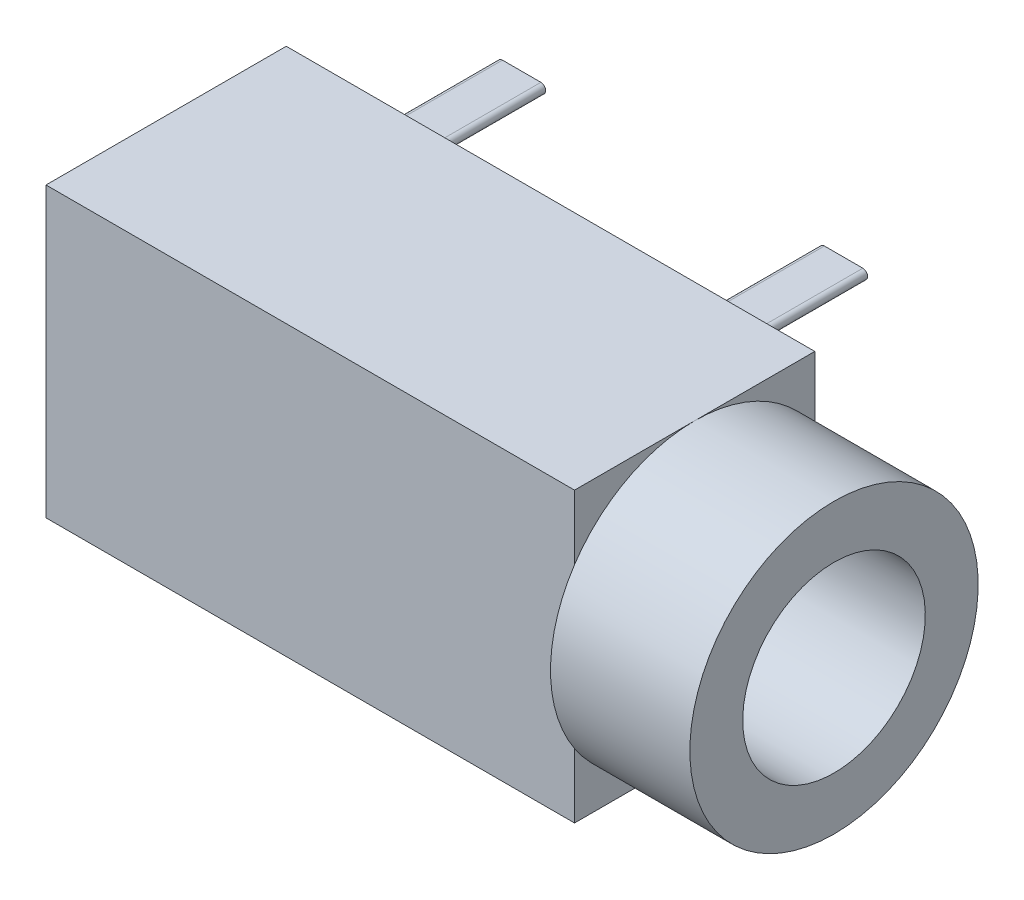
ISO-10303-21;
HEADER;
FILE_DESCRIPTION(('STEP AP214'),'2;1');
FILE_NAME('part.step','',(''),(''),'','','');
FILE_SCHEMA(('AUTOMOTIVE_DESIGN { 1 0 10303 214 1 1 1 1 }'));
ENDSEC;
DATA;
#1=APPLICATION_CONTEXT('core data for automotive mechanical design processes');
#2=APPLICATION_PROTOCOL_DEFINITION('international standard','automotive_design',2000,#1);
#3=PRODUCT_CONTEXT('',#1,'mechanical');
#4=PRODUCT('Part','Part','',(#3));
#5=PRODUCT_RELATED_PRODUCT_CATEGORY('part','',(#4));
#6=PRODUCT_DEFINITION_FORMATION('','',#4);
#7=PRODUCT_DEFINITION_CONTEXT('part definition',#1,'design');
#8=PRODUCT_DEFINITION('design','',#6,#7);
#9=PRODUCT_DEFINITION_SHAPE('','',#8);
#10=(LENGTH_UNIT() NAMED_UNIT(*) SI_UNIT(.MILLI.,.METRE.));
#11=(NAMED_UNIT(*) PLANE_ANGLE_UNIT() SI_UNIT($,.RADIAN.));
#12=(NAMED_UNIT(*) SI_UNIT($,.STERADIAN.) SOLID_ANGLE_UNIT());
#13=UNCERTAINTY_MEASURE_WITH_UNIT(LENGTH_MEASURE(1.E-05),#10,'distance_accuracy_value','');
#14=(GEOMETRIC_REPRESENTATION_CONTEXT(3) GLOBAL_UNCERTAINTY_ASSIGNED_CONTEXT((#13)) GLOBAL_UNIT_ASSIGNED_CONTEXT((#10,
#11,#12)) REPRESENTATION_CONTEXT('',''));
#15=CARTESIAN_POINT('',(0.,0.,0.));
#16=DIRECTION('',(0.,0.,1.));
#17=DIRECTION('',(1.,0.,0.));
#18=AXIS2_PLACEMENT_3D('',#15,#16,#17);
#19=CARTESIAN_POINT('',(0.,0.,0.));
#20=DIRECTION('',(0.,0.,1.));
#21=DIRECTION('',(1.,0.,0.));
#22=AXIS2_PLACEMENT_3D('',#19,#20,#21);
#23=PLANE('',#22);
#24=CARTESIAN_POINT('',(-3.9,2.,0.));
#25=DIRECTION('',(0.,0.,-1.));
#26=DIRECTION('',(-1.,0.,0.));
#27=AXIS2_PLACEMENT_3D('',#24,#25,#26);
#28=CIRCLE('',#27,0.1);
#29=CARTESIAN_POINT('',(-3.9,1.9,0.));
#30=VERTEX_POINT('',#29);
#31=CARTESIAN_POINT('',(-3.9,2.1,0.));
#32=VERTEX_POINT('',#31);
#33=EDGE_CURVE('E187',#30,#32,#28,.T.);
#34=ORIENTED_EDGE('',*,*,#33,.F.);
#35=DIRECTION('',(-1.,0.,0.));
#36=VECTOR('',#35,1.);
#37=CARTESIAN_POINT('',(-3.9,1.9,0.));
#38=LINE('',#37,#36);
#39=CARTESIAN_POINT('',(-3.1,1.9,0.));
#40=VERTEX_POINT('',#39);
#41=EDGE_CURVE('E200',#40,#30,#38,.T.);
#42=ORIENTED_EDGE('',*,*,#41,.F.);
#43=CARTESIAN_POINT('',(-3.1,2.,0.));
#44=DIRECTION('',(0.,0.,-1.));
#45=DIRECTION('',(-1.,0.,0.));
#46=AXIS2_PLACEMENT_3D('',#43,#44,#45);
#47=CIRCLE('',#46,0.1);
#48=CARTESIAN_POINT('',(-3.1,2.1,0.));
#49=VERTEX_POINT('',#48);
#50=EDGE_CURVE('E209',#49,#40,#47,.T.);
#51=ORIENTED_EDGE('',*,*,#50,.F.);
#52=DIRECTION('',(1.,0.,0.));
#53=VECTOR('',#52,1.);
#54=CARTESIAN_POINT('',(-3.9,2.1,0.));
#55=LINE('',#54,#53);
#56=EDGE_CURVE('E190',#32,#49,#55,.T.);
#57=ORIENTED_EDGE('',*,*,#56,.F.);
#58=EDGE_LOOP('',(#34,#42,#51,#57));
#59=FACE_BOUND('',#58,.T.);
#60=DIRECTION('',(0.,1.,0.));
#61=VECTOR('',#60,1.);
#62=CARTESIAN_POINT('',(5.5,3.,0.));
#63=LINE('',#62,#61);
#64=CARTESIAN_POINT('',(5.5,-3.,0.));
#65=VERTEX_POINT('',#64);
#66=CARTESIAN_POINT('',(5.5,-1.6583123951777,0.));
#67=VERTEX_POINT('',#66);
#68=EDGE_CURVE('E284',#65,#67,#63,.T.);
#69=ORIENTED_EDGE('',*,*,#68,.F.);
#70=DIRECTION('',(1.,0.,0.));
#71=VECTOR('',#70,1.);
#72=CARTESIAN_POINT('',(-5.5,-3.,0.));
#73=LINE('',#72,#71);
#74=CARTESIAN_POINT('',(-5.5,-3.,0.));
#75=VERTEX_POINT('',#74);
#76=EDGE_CURVE('E292',#75,#65,#73,.T.);
#77=ORIENTED_EDGE('',*,*,#76,.F.);
#78=DIRECTION('',(0.,-1.,0.));
#79=VECTOR('',#78,1.);
#80=CARTESIAN_POINT('',(-5.5,3.,0.));
#81=LINE('',#80,#79);
#82=CARTESIAN_POINT('',(-5.5,3.,0.));
#83=VERTEX_POINT('',#82);
#84=EDGE_CURVE('E290',#83,#75,#81,.T.);
#85=ORIENTED_EDGE('',*,*,#84,.F.);
#86=DIRECTION('',(-1.,0.,0.));
#87=VECTOR('',#86,1.);
#88=CARTESIAN_POINT('',(-5.5,3.,0.));
#89=LINE('',#88,#87);
#90=CARTESIAN_POINT('',(5.5,3.,0.));
#91=VERTEX_POINT('',#90);
#92=EDGE_CURVE('E287',#91,#83,#89,.T.);
#93=ORIENTED_EDGE('',*,*,#92,.F.);
#94=CARTESIAN_POINT('',(5.5,1.6583123951777,0.));
#95=VERTEX_POINT('',#94);
#96=EDGE_CURVE('E267',#95,#91,#63,.T.);
#97=ORIENTED_EDGE('',*,*,#96,.F.);
#98=EDGE_CURVE('E288',#67,#95,#63,.T.);
#99=ORIENTED_EDGE('',*,*,#98,.F.);
#100=EDGE_LOOP('',(#69,#77,#85,#93,#97,#99));
#101=FACE_BOUND('',#100,.T.);
#102=CARTESIAN_POINT('',(3.6,2.,0.));
#103=DIRECTION('',(0.,0.,-1.));
#104=DIRECTION('',(-1.,0.,0.));
#105=AXIS2_PLACEMENT_3D('',#102,#103,#104);
#106=CIRCLE('',#105,0.0999999999999998);
#107=CARTESIAN_POINT('',(3.6,2.1,0.));
#108=VERTEX_POINT('',#107);
#109=CARTESIAN_POINT('',(3.6,1.9,0.));
#110=VERTEX_POINT('',#109);
#111=EDGE_CURVE('E225',#108,#110,#106,.T.);
#112=ORIENTED_EDGE('',*,*,#111,.F.);
#113=DIRECTION('',(1.,0.,0.));
#114=VECTOR('',#113,1.);
#115=CARTESIAN_POINT('',(3.6,2.1,0.));
#116=LINE('',#115,#114);
#117=CARTESIAN_POINT('',(2.8,2.1,0.));
#118=VERTEX_POINT('',#117);
#119=EDGE_CURVE('E230',#118,#108,#116,.T.);
#120=ORIENTED_EDGE('',*,*,#119,.F.);
#121=CARTESIAN_POINT('',(2.8,2.,0.));
#122=DIRECTION('',(0.,0.,-1.));
#123=DIRECTION('',(-1.,0.,0.));
#124=AXIS2_PLACEMENT_3D('',#121,#122,#123);
#125=CIRCLE('',#124,0.0999999999999997);
#126=CARTESIAN_POINT('',(2.8,1.9,0.));
#127=VERTEX_POINT('',#126);
#128=EDGE_CURVE('E242',#127,#118,#125,.T.);
#129=ORIENTED_EDGE('',*,*,#128,.F.);
#130=DIRECTION('',(-1.,0.,0.));
#131=VECTOR('',#130,1.);
#132=CARTESIAN_POINT('',(3.6,1.9,0.));
#133=LINE('',#132,#131);
#134=EDGE_CURVE('E239',#110,#127,#133,.T.);
#135=ORIENTED_EDGE('',*,*,#134,.F.);
#136=EDGE_LOOP('',(#112,#120,#129,#135));
#137=FACE_BOUND('',#136,.T.);
#138=CARTESIAN_POINT('',(1.7,-2.,0.));
#139=DIRECTION('',(0.,0.,-1.));
#140=DIRECTION('',(-1.,0.,0.));
#141=AXIS2_PLACEMENT_3D('',#138,#139,#140);
#142=CIRCLE('',#141,0.0999999999999998);
#143=CARTESIAN_POINT('',(1.7,-1.9,0.));
#144=VERTEX_POINT('',#143);
#145=CARTESIAN_POINT('',(1.7,-2.1,0.));
#146=VERTEX_POINT('',#145);
#147=EDGE_CURVE('E186',#144,#146,#142,.T.);
#148=ORIENTED_EDGE('',*,*,#147,.F.);
#149=DIRECTION('',(1.,0.,0.));
#150=VECTOR('',#149,1.);
#151=CARTESIAN_POINT('',(1.7,-1.9,0.));
#152=LINE('',#151,#150);
#153=CARTESIAN_POINT('',(0.900000000000001,-1.9,0.));
#154=VERTEX_POINT('',#153);
#155=EDGE_CURVE('E183',#154,#144,#152,.T.);
#156=ORIENTED_EDGE('',*,*,#155,.F.);
#157=CARTESIAN_POINT('',(0.900000000000001,-2.,0.));
#158=DIRECTION('',(0.,0.,-1.));
#159=DIRECTION('',(-1.,0.,0.));
#160=AXIS2_PLACEMENT_3D('',#157,#158,#159);
#161=CIRCLE('',#160,0.0999999999999999);
#162=CARTESIAN_POINT('',(0.900000000000001,-2.1,0.));
#163=VERTEX_POINT('',#162);
#164=EDGE_CURVE('E55',#163,#154,#161,.T.);
#165=ORIENTED_EDGE('',*,*,#164,.F.);
#166=DIRECTION('',(-1.,0.,0.));
#167=VECTOR('',#166,1.);
#168=CARTESIAN_POINT('',(1.7,-2.1,0.));
#169=LINE('',#168,#167);
#170=EDGE_CURVE('E50',#146,#163,#169,.T.);
#171=ORIENTED_EDGE('',*,*,#170,.F.);
#172=EDGE_LOOP('',(#148,#156,#165,#171));
#173=FACE_BOUND('',#172,.T.);
#174=ADVANCED_FACE('F32',(#59,#101,#137,#173),#23,.F.);
#175=CARTESIAN_POINT('',(5.5,3.,5.));
#176=DIRECTION('',(-1.,0.,0.));
#177=DIRECTION('',(0.,-1.,0.));
#178=AXIS2_PLACEMENT_3D('',#175,#176,#177);
#179=PLANE('',#178);
#180=CARTESIAN_POINT('',(5.5,0.,2.5));
#181=DIRECTION('',(1.,0.,0.));
#182=DIRECTION('',(0.,1.,0.));
#183=AXIS2_PLACEMENT_3D('',#180,#181,#182);
#184=CIRCLE('',#183,3.);
#185=CARTESIAN_POINT('',(5.5,-1.6583123951777,5.));
#186=VERTEX_POINT('',#185);
#187=CARTESIAN_POINT('',(5.5,-3.,2.5));
#188=VERTEX_POINT('',#187);
#189=EDGE_CURVE('E11',#186,#188,#184,.T.);
#190=ORIENTED_EDGE('',*,*,#189,.F.);
#191=DIRECTION('',(0.,1.,0.));
#192=VECTOR('',#191,1.);
#193=CARTESIAN_POINT('',(5.5,3.,5.));
#194=LINE('',#193,#192);
#195=CARTESIAN_POINT('',(5.5,-3.,5.));
#196=VERTEX_POINT('',#195);
#197=EDGE_CURVE('E272',#196,#186,#194,.T.);
#198=ORIENTED_EDGE('',*,*,#197,.F.);
#199=DIRECTION('',(0.,0.,-1.));
#200=VECTOR('',#199,1.);
#201=CARTESIAN_POINT('',(5.5,-3.,5.));
#202=LINE('',#201,#200);
#203=EDGE_CURVE('E295',#196,#188,#202,.T.);
#204=ORIENTED_EDGE('',*,*,#203,.T.);
#205=EDGE_LOOP('',(#190,#198,#204));
#206=FACE_BOUND('',#205,.T.);
#207=ADVANCED_FACE('F330',(#206),#179,.F.);
#208=EDGE_CURVE('E41',#188,#67,#184,.T.);
#209=ORIENTED_EDGE('',*,*,#208,.F.);
#210=EDGE_CURVE('E283',#188,#65,#202,.T.);
#211=ORIENTED_EDGE('',*,*,#210,.T.);
#212=ORIENTED_EDGE('',*,*,#68,.T.);
#213=EDGE_LOOP('',(#209,#211,#212));
#214=FACE_BOUND('',#213,.T.);
#215=ADVANCED_FACE('F321',(#214),#179,.F.);
#216=CARTESIAN_POINT('',(5.5,3.,2.5));
#217=VERTEX_POINT('',#216);
#218=CARTESIAN_POINT('',(5.5,1.6583123951777,5.));
#219=VERTEX_POINT('',#218);
#220=EDGE_CURVE('E268',#217,#219,#184,.T.);
#221=ORIENTED_EDGE('',*,*,#220,.F.);
#222=DIRECTION('',(0.,0.,-1.));
#223=VECTOR('',#222,1.);
#224=CARTESIAN_POINT('',(5.5,3.,5.));
#225=LINE('',#224,#223);
#226=CARTESIAN_POINT('',(5.5,3.,5.));
#227=VERTEX_POINT('',#226);
#228=EDGE_CURVE('E36',#227,#217,#225,.T.);
#229=ORIENTED_EDGE('',*,*,#228,.F.);
#230=EDGE_CURVE('E277',#219,#227,#194,.T.);
#231=ORIENTED_EDGE('',*,*,#230,.F.);
#232=EDGE_LOOP('',(#221,#229,#231));
#233=FACE_BOUND('',#232,.T.);
#234=ADVANCED_FACE('F340',(#233),#179,.F.);
#235=EDGE_CURVE('E271',#95,#217,#184,.T.);
#236=ORIENTED_EDGE('',*,*,#235,.F.);
#237=ORIENTED_EDGE('',*,*,#96,.T.);
#238=EDGE_CURVE('E302',#217,#91,#225,.T.);
#239=ORIENTED_EDGE('',*,*,#238,.F.);
#240=EDGE_LOOP('',(#236,#237,#239));
#241=FACE_BOUND('',#240,.T.);
#242=ADVANCED_FACE('F34',(#241),#179,.F.);
#243=CARTESIAN_POINT('',(-5.5,3.,5.));
#244=DIRECTION('',(0.,-1.,0.));
#245=DIRECTION('',(0.,0.,-1.));
#246=AXIS2_PLACEMENT_3D('',#243,#244,#245);
#247=PLANE('',#246);
#248=ORIENTED_EDGE('',*,*,#92,.T.);
#249=DIRECTION('',(0.,0.,-1.));
#250=VECTOR('',#249,1.);
#251=CARTESIAN_POINT('',(-5.5,3.,5.));
#252=LINE('',#251,#250);
#253=CARTESIAN_POINT('',(-5.5,3.,5.));
#254=VERTEX_POINT('',#253);
#255=EDGE_CURVE('E300',#254,#83,#252,.T.);
#256=ORIENTED_EDGE('',*,*,#255,.F.);
#257=DIRECTION('',(-1.,0.,0.));
#258=VECTOR('',#257,1.);
#259=CARTESIAN_POINT('',(-5.5,3.,5.));
#260=LINE('',#259,#258);
#261=EDGE_CURVE('E275',#227,#254,#260,.T.);
#262=ORIENTED_EDGE('',*,*,#261,.F.);
#263=ORIENTED_EDGE('',*,*,#228,.T.);
#264=ORIENTED_EDGE('',*,*,#238,.T.);
#265=EDGE_LOOP('',(#248,#256,#262,#263,#264));
#266=FACE_BOUND('',#265,.T.);
#267=ADVANCED_FACE('F341',(#266),#247,.F.);
#268=CARTESIAN_POINT('',(-5.5,3.,5.));
#269=DIRECTION('',(1.,0.,0.));
#270=DIRECTION('',(0.,1.,0.));
#271=AXIS2_PLACEMENT_3D('',#268,#269,#270);
#272=PLANE('',#271);
#273=ORIENTED_EDGE('',*,*,#84,.T.);
#274=DIRECTION('',(0.,0.,-1.));
#275=VECTOR('',#274,1.);
#276=CARTESIAN_POINT('',(-5.5,-3.,5.));
#277=LINE('',#276,#275);
#278=CARTESIAN_POINT('',(-5.5,-3.,5.));
#279=VERTEX_POINT('',#278);
#280=EDGE_CURVE('E298',#279,#75,#277,.T.);
#281=ORIENTED_EDGE('',*,*,#280,.F.);
#282=DIRECTION('',(0.,-1.,0.));
#283=VECTOR('',#282,1.);
#284=CARTESIAN_POINT('',(-5.5,3.,5.));
#285=LINE('',#284,#283);
#286=EDGE_CURVE('E279',#254,#279,#285,.T.);
#287=ORIENTED_EDGE('',*,*,#286,.F.);
#288=ORIENTED_EDGE('',*,*,#255,.T.);
#289=EDGE_LOOP('',(#273,#281,#287,#288));
#290=FACE_BOUND('',#289,.T.);
#291=ADVANCED_FACE('F344',(#290),#272,.F.);
#292=CARTESIAN_POINT('',(-5.5,-3.,5.));
#293=DIRECTION('',(0.,1.,0.));
#294=DIRECTION('',(0.,0.,1.));
#295=AXIS2_PLACEMENT_3D('',#292,#293,#294);
#296=PLANE('',#295);
#297=ORIENTED_EDGE('',*,*,#76,.T.);
#298=ORIENTED_EDGE('',*,*,#210,.F.);
#299=ORIENTED_EDGE('',*,*,#203,.F.);
#300=DIRECTION('',(1.,0.,0.));
#301=VECTOR('',#300,1.);
#302=CARTESIAN_POINT('',(-5.5,-3.,5.));
#303=LINE('',#302,#301);
#304=EDGE_CURVE('E281',#279,#196,#303,.T.);
#305=ORIENTED_EDGE('',*,*,#304,.F.);
#306=ORIENTED_EDGE('',*,*,#280,.T.);
#307=EDGE_LOOP('',(#297,#298,#299,#305,#306));
#308=FACE_BOUND('',#307,.T.);
#309=ADVANCED_FACE('F325',(#308),#296,.F.);
#310=CARTESIAN_POINT('',(0.,0.,5.));
#311=DIRECTION('',(0.,0.,1.));
#312=DIRECTION('',(1.,0.,0.));
#313=AXIS2_PLACEMENT_3D('',#310,#311,#312);
#314=PLANE('',#313);
#315=ORIENTED_EDGE('',*,*,#197,.T.);
#316=EDGE_CURVE('E276',#186,#219,#194,.T.);
#317=ORIENTED_EDGE('',*,*,#316,.T.);
#318=ORIENTED_EDGE('',*,*,#230,.T.);
#319=ORIENTED_EDGE('',*,*,#261,.T.);
#320=ORIENTED_EDGE('',*,*,#286,.T.);
#321=ORIENTED_EDGE('',*,*,#304,.T.);
#322=EDGE_LOOP('',(#315,#317,#318,#319,#320,#321));
#323=FACE_BOUND('',#322,.T.);
#324=ADVANCED_FACE('F334',(#323),#314,.T.);
#325=CARTESIAN_POINT('',(5.5,0.,2.5));
#326=DIRECTION('',(1.,0.,0.));
#327=DIRECTION('',(0.,1.,0.));
#328=AXIS2_PLACEMENT_3D('',#325,#326,#327);
#329=PLANE('',#328);
#330=EDGE_CURVE('E262',#67,#95,#184,.T.);
#331=ORIENTED_EDGE('',*,*,#330,.F.);
#332=ORIENTED_EDGE('',*,*,#98,.T.);
#333=EDGE_LOOP('',(#331,#332));
#334=FACE_BOUND('',#333,.T.);
#335=ADVANCED_FACE('F388',(#334),#329,.F.);
#336=CARTESIAN_POINT('',(8.4,0.,2.5));
#337=DIRECTION('',(1.,0.,0.));
#338=DIRECTION('',(0.,1.,0.));
#339=AXIS2_PLACEMENT_3D('',#336,#337,#338);
#340=PLANE('',#339);
#341=CARTESIAN_POINT('',(8.4,0.,2.5));
#342=DIRECTION('',(1.,0.,0.));
#343=DIRECTION('',(0.,1.,0.));
#344=AXIS2_PLACEMENT_3D('',#341,#342,#343);
#345=CIRCLE('',#344,3.);
#346=CARTESIAN_POINT('',(8.4,3.,2.5));
#347=VERTEX_POINT('',#346);
#348=EDGE_CURVE('E265',#347,#347,#345,.T.);
#349=ORIENTED_EDGE('',*,*,#348,.T.);
#350=EDGE_LOOP('',(#349));
#351=FACE_BOUND('',#350,.T.);
#352=CARTESIAN_POINT('',(8.4,0.,2.5));
#353=DIRECTION('',(1.,0.,0.));
#354=DIRECTION('',(0.,1.,0.));
#355=AXIS2_PLACEMENT_3D('',#352,#353,#354);
#356=CIRCLE('',#355,1.9);
#357=CARTESIAN_POINT('',(8.4,1.9,2.5));
#358=VERTEX_POINT('',#357);
#359=EDGE_CURVE('E259',#358,#358,#356,.T.);
#360=ORIENTED_EDGE('',*,*,#359,.F.);
#361=EDGE_LOOP('',(#360));
#362=FACE_BOUND('',#361,.T.);
#363=ADVANCED_FACE('F394',(#351,#362),#340,.T.);
#364=ORIENTED_EDGE('',*,*,#316,.F.);
#365=EDGE_CURVE('E43',#219,#186,#184,.T.);
#366=ORIENTED_EDGE('',*,*,#365,.F.);
#367=EDGE_LOOP('',(#364,#366));
#368=FACE_BOUND('',#367,.T.);
#369=ADVANCED_FACE('F337',(#368),#329,.F.);
#370=CARTESIAN_POINT('',(8.4,0.,2.5));
#371=DIRECTION('',(-1.,0.,0.));
#372=DIRECTION('',(0.,-1.,0.));
#373=AXIS2_PLACEMENT_3D('',#370,#371,#372);
#374=CYLINDRICAL_SURFACE('',#373,3.);
#375=ORIENTED_EDGE('',*,*,#348,.F.);
#376=EDGE_LOOP('',(#375));
#377=FACE_BOUND('',#376,.T.);
#378=ORIENTED_EDGE('',*,*,#220,.T.);
#379=ORIENTED_EDGE('',*,*,#365,.T.);
#380=ORIENTED_EDGE('',*,*,#189,.T.);
#381=ORIENTED_EDGE('',*,*,#208,.T.);
#382=ORIENTED_EDGE('',*,*,#330,.T.);
#383=ORIENTED_EDGE('',*,*,#235,.T.);
#384=EDGE_LOOP('',(#378,#379,#380,#381,#382,#383));
#385=FACE_BOUND('',#384,.T.);
#386=ADVANCED_FACE('F316',(#377,#385),#374,.T.);
#387=CARTESIAN_POINT('',(8.4,0.,2.5));
#388=DIRECTION('',(-1.,0.,0.));
#389=DIRECTION('',(0.,-1.,0.));
#390=AXIS2_PLACEMENT_3D('',#387,#388,#389);
#391=CYLINDRICAL_SURFACE('',#390,1.9);
#392=ORIENTED_EDGE('',*,*,#359,.T.);
#393=EDGE_LOOP('',(#392));
#394=FACE_BOUND('',#393,.T.);
#395=CARTESIAN_POINT('',(5.5,0.,2.5));
#396=DIRECTION('',(1.,0.,0.));
#397=DIRECTION('',(0.,1.,0.));
#398=AXIS2_PLACEMENT_3D('',#395,#396,#397);
#399=CIRCLE('',#398,1.9);
#400=CARTESIAN_POINT('',(5.5,1.9,2.5));
#401=VERTEX_POINT('',#400);
#402=EDGE_CURVE('E258',#401,#401,#399,.T.);
#403=ORIENTED_EDGE('',*,*,#402,.F.);
#404=EDGE_LOOP('',(#403));
#405=FACE_BOUND('',#404,.T.);
#406=ADVANCED_FACE('F360',(#394,#405),#391,.F.);
#407=ORIENTED_EDGE('',*,*,#402,.T.);
#408=EDGE_LOOP('',(#407));
#409=FACE_BOUND('',#408,.T.);
#410=ADVANCED_FACE('F352',(#409),#179,.F.);
#411=CARTESIAN_POINT('',(3.6,2.,-2.9));
#412=DIRECTION('',(0.,0.,1.));
#413=DIRECTION('',(1.,0.,0.));
#414=AXIS2_PLACEMENT_3D('',#411,#412,#413);
#415=CYLINDRICAL_SURFACE('',#414,0.0999999999999998);
#416=ORIENTED_EDGE('',*,*,#111,.T.);
#417=DIRECTION('',(0.,0.,1.));
#418=VECTOR('',#417,1.);
#419=CARTESIAN_POINT('',(3.6,1.9,-2.9));
#420=LINE('',#419,#418);
#421=CARTESIAN_POINT('',(3.6,1.9,-2.9));
#422=VERTEX_POINT('',#421);
#423=EDGE_CURVE('E255',#422,#110,#420,.T.);
#424=ORIENTED_EDGE('',*,*,#423,.F.);
#425=CARTESIAN_POINT('',(3.6,2.,-2.9));
#426=DIRECTION('',(0.,0.,-1.));
#427=DIRECTION('',(-1.,0.,0.));
#428=AXIS2_PLACEMENT_3D('',#425,#426,#427);
#429=CIRCLE('',#428,0.0999999999999998);
#430=CARTESIAN_POINT('',(3.6,2.1,-2.9));
#431=VERTEX_POINT('',#430);
#432=EDGE_CURVE('E226',#431,#422,#429,.T.);
#433=ORIENTED_EDGE('',*,*,#432,.F.);
#434=DIRECTION('',(0.,0.,1.));
#435=VECTOR('',#434,1.);
#436=CARTESIAN_POINT('',(3.6,2.1,-2.9));
#437=LINE('',#436,#435);
#438=EDGE_CURVE('E236',#431,#108,#437,.T.);
#439=ORIENTED_EDGE('',*,*,#438,.T.);
#440=EDGE_LOOP('',(#416,#424,#433,#439));
#441=FACE_BOUND('',#440,.T.);
#442=ADVANCED_FACE('F359',(#441),#415,.T.);
#443=CARTESIAN_POINT('',(3.6,1.9,-2.9));
#444=DIRECTION('',(0.,1.,0.));
#445=DIRECTION('',(-1.,0.,0.));
#446=AXIS2_PLACEMENT_3D('',#443,#444,#445);
#447=PLANE('',#446);
#448=ORIENTED_EDGE('',*,*,#134,.T.);
#449=DIRECTION('',(0.,0.,1.));
#450=VECTOR('',#449,1.);
#451=CARTESIAN_POINT('',(2.8,1.9,-2.9));
#452=LINE('',#451,#450);
#453=CARTESIAN_POINT('',(2.8,1.9,-2.9));
#454=VERTEX_POINT('',#453);
#455=EDGE_CURVE('E252',#454,#127,#452,.T.);
#456=ORIENTED_EDGE('',*,*,#455,.F.);
#457=DIRECTION('',(-1.,0.,0.));
#458=VECTOR('',#457,1.);
#459=CARTESIAN_POINT('',(3.6,1.9,-2.9));
#460=LINE('',#459,#458);
#461=EDGE_CURVE('E229',#422,#454,#460,.T.);
#462=ORIENTED_EDGE('',*,*,#461,.F.);
#463=ORIENTED_EDGE('',*,*,#423,.T.);
#464=EDGE_LOOP('',(#448,#456,#462,#463));
#465=FACE_BOUND('',#464,.T.);
#466=ADVANCED_FACE('F430',(#465),#447,.F.);
#467=CARTESIAN_POINT('',(2.8,2.,-2.9));
#468=DIRECTION('',(0.,0.,1.));
#469=DIRECTION('',(1.,0.,0.));
#470=AXIS2_PLACEMENT_3D('',#467,#468,#469);
#471=CYLINDRICAL_SURFACE('',#470,0.0999999999999997);
#472=ORIENTED_EDGE('',*,*,#128,.T.);
#473=DIRECTION('',(0.,0.,1.));
#474=VECTOR('',#473,1.);
#475=CARTESIAN_POINT('',(2.8,2.1,-2.9));
#476=LINE('',#475,#474);
#477=CARTESIAN_POINT('',(2.8,2.1,-2.9));
#478=VERTEX_POINT('',#477);
#479=EDGE_CURVE('E249',#478,#118,#476,.T.);
#480=ORIENTED_EDGE('',*,*,#479,.F.);
#481=CARTESIAN_POINT('',(2.8,2.,-2.9));
#482=DIRECTION('',(0.,0.,-1.));
#483=DIRECTION('',(-1.,0.,0.));
#484=AXIS2_PLACEMENT_3D('',#481,#482,#483);
#485=CIRCLE('',#484,0.0999999999999997);
#486=EDGE_CURVE('E232',#454,#478,#485,.T.);
#487=ORIENTED_EDGE('',*,*,#486,.F.);
#488=ORIENTED_EDGE('',*,*,#455,.T.);
#489=EDGE_LOOP('',(#472,#480,#487,#488));
#490=FACE_BOUND('',#489,.T.);
#491=ADVANCED_FACE('F438',(#490),#471,.T.);
#492=CARTESIAN_POINT('',(3.6,2.1,-2.9));
#493=DIRECTION('',(0.,-1.,0.));
#494=DIRECTION('',(0.,0.,-1.));
#495=AXIS2_PLACEMENT_3D('',#492,#493,#494);
#496=PLANE('',#495);
#497=ORIENTED_EDGE('',*,*,#119,.T.);
#498=ORIENTED_EDGE('',*,*,#438,.F.);
#499=DIRECTION('',(1.,0.,0.));
#500=VECTOR('',#499,1.);
#501=CARTESIAN_POINT('',(3.6,2.1,-2.9));
#502=LINE('',#501,#500);
#503=EDGE_CURVE('E234',#478,#431,#502,.T.);
#504=ORIENTED_EDGE('',*,*,#503,.F.);
#505=ORIENTED_EDGE('',*,*,#479,.T.);
#506=EDGE_LOOP('',(#497,#498,#504,#505));
#507=FACE_BOUND('',#506,.T.);
#508=ADVANCED_FACE('F446',(#507),#496,.F.);
#509=CARTESIAN_POINT('',(3.6,2.,-2.9));
#510=DIRECTION('',(0.,0.,-1.));
#511=DIRECTION('',(-1.,0.,0.));
#512=AXIS2_PLACEMENT_3D('',#509,#510,#511);
#513=PLANE('',#512);
#514=ORIENTED_EDGE('',*,*,#432,.T.);
#515=ORIENTED_EDGE('',*,*,#461,.T.);
#516=ORIENTED_EDGE('',*,*,#486,.T.);
#517=ORIENTED_EDGE('',*,*,#503,.T.);
#518=EDGE_LOOP('',(#514,#515,#516,#517));
#519=FACE_BOUND('',#518,.T.);
#520=ADVANCED_FACE('F454',(#519),#513,.T.);
#521=CARTESIAN_POINT('',(-3.9,2.,-2.9));
#522=DIRECTION('',(0.,0.,1.));
#523=DIRECTION('',(1.,0.,0.));
#524=AXIS2_PLACEMENT_3D('',#521,#522,#523);
#525=CYLINDRICAL_SURFACE('',#524,0.1);
#526=ORIENTED_EDGE('',*,*,#33,.T.);
#527=DIRECTION('',(0.,0.,1.));
#528=VECTOR('',#527,1.);
#529=CARTESIAN_POINT('',(-3.9,2.1,-2.9));
#530=LINE('',#529,#528);
#531=CARTESIAN_POINT('',(-3.9,2.1,-2.9));
#532=VERTEX_POINT('',#531);
#533=EDGE_CURVE('E222',#532,#32,#530,.T.);
#534=ORIENTED_EDGE('',*,*,#533,.F.);
#535=CARTESIAN_POINT('',(-3.9,2.,-2.9));
#536=DIRECTION('',(0.,0.,-1.));
#537=DIRECTION('',(-1.,0.,0.));
#538=AXIS2_PLACEMENT_3D('',#535,#536,#537);
#539=CIRCLE('',#538,0.1);
#540=CARTESIAN_POINT('',(-3.9,1.9,-2.9));
#541=VERTEX_POINT('',#540);
#542=EDGE_CURVE('E196',#541,#532,#539,.T.);
#543=ORIENTED_EDGE('',*,*,#542,.F.);
#544=DIRECTION('',(0.,0.,1.));
#545=VECTOR('',#544,1.);
#546=CARTESIAN_POINT('',(-3.9,1.9,-2.9));
#547=LINE('',#546,#545);
#548=EDGE_CURVE('E205',#541,#30,#547,.T.);
#549=ORIENTED_EDGE('',*,*,#548,.T.);
#550=EDGE_LOOP('',(#526,#534,#543,#549));
#551=FACE_BOUND('',#550,.T.);
#552=ADVANCED_FACE('F462',(#551),#525,.T.);
#553=CARTESIAN_POINT('',(-3.9,2.1,-2.9));
#554=DIRECTION('',(0.,-1.,0.));
#555=DIRECTION('',(1.,0.,0.));
#556=AXIS2_PLACEMENT_3D('',#553,#554,#555);
#557=PLANE('',#556);
#558=ORIENTED_EDGE('',*,*,#56,.T.);
#559=DIRECTION('',(0.,0.,1.));
#560=VECTOR('',#559,1.);
#561=CARTESIAN_POINT('',(-3.1,2.1,-2.9));
#562=LINE('',#561,#560);
#563=CARTESIAN_POINT('',(-3.1,2.1,-2.9));
#564=VERTEX_POINT('',#563);
#565=EDGE_CURVE('E219',#564,#49,#562,.T.);
#566=ORIENTED_EDGE('',*,*,#565,.F.);
#567=DIRECTION('',(1.,0.,0.));
#568=VECTOR('',#567,1.);
#569=CARTESIAN_POINT('',(-3.9,2.1,-2.9));
#570=LINE('',#569,#568);
#571=EDGE_CURVE('E199',#532,#564,#570,.T.);
#572=ORIENTED_EDGE('',*,*,#571,.F.);
#573=ORIENTED_EDGE('',*,*,#533,.T.);
#574=EDGE_LOOP('',(#558,#566,#572,#573));
#575=FACE_BOUND('',#574,.T.);
#576=ADVANCED_FACE('F470',(#575),#557,.F.);
#577=CARTESIAN_POINT('',(-3.1,2.,-2.9));
#578=DIRECTION('',(0.,0.,1.));
#579=DIRECTION('',(1.,0.,0.));
#580=AXIS2_PLACEMENT_3D('',#577,#578,#579);
#581=CYLINDRICAL_SURFACE('',#580,0.1);
#582=ORIENTED_EDGE('',*,*,#50,.T.);
#583=DIRECTION('',(0.,0.,1.));
#584=VECTOR('',#583,1.);
#585=CARTESIAN_POINT('',(-3.1,1.9,-2.9));
#586=LINE('',#585,#584);
#587=CARTESIAN_POINT('',(-3.1,1.9,-2.9));
#588=VERTEX_POINT('',#587);
#589=EDGE_CURVE('E216',#588,#40,#586,.T.);
#590=ORIENTED_EDGE('',*,*,#589,.F.);
#591=CARTESIAN_POINT('',(-3.1,2.,-2.9));
#592=DIRECTION('',(0.,0.,-1.));
#593=DIRECTION('',(-1.,0.,0.));
#594=AXIS2_PLACEMENT_3D('',#591,#592,#593);
#595=CIRCLE('',#594,0.1);
#596=EDGE_CURVE('E202',#564,#588,#595,.T.);
#597=ORIENTED_EDGE('',*,*,#596,.F.);
#598=ORIENTED_EDGE('',*,*,#565,.T.);
#599=EDGE_LOOP('',(#582,#590,#597,#598));
#600=FACE_BOUND('',#599,.T.);
#601=ADVANCED_FACE('F478',(#600),#581,.T.);
#602=CARTESIAN_POINT('',(-3.9,1.9,-2.9));
#603=DIRECTION('',(0.,1.,0.));
#604=DIRECTION('',(-1.,0.,0.));
#605=AXIS2_PLACEMENT_3D('',#602,#603,#604);
#606=PLANE('',#605);
#607=ORIENTED_EDGE('',*,*,#41,.T.);
#608=ORIENTED_EDGE('',*,*,#548,.F.);
#609=DIRECTION('',(-1.,0.,0.));
#610=VECTOR('',#609,1.);
#611=CARTESIAN_POINT('',(-3.9,1.9,-2.9));
#612=LINE('',#611,#610);
#613=EDGE_CURVE('E204',#588,#541,#612,.T.);
#614=ORIENTED_EDGE('',*,*,#613,.F.);
#615=ORIENTED_EDGE('',*,*,#589,.T.);
#616=EDGE_LOOP('',(#607,#608,#614,#615));
#617=FACE_BOUND('',#616,.T.);
#618=ADVANCED_FACE('F486',(#617),#606,.F.);
#619=CARTESIAN_POINT('',(-3.9,2.,-2.9));
#620=DIRECTION('',(0.,0.,-1.));
#621=DIRECTION('',(-1.,0.,0.));
#622=AXIS2_PLACEMENT_3D('',#619,#620,#621);
#623=PLANE('',#622);
#624=ORIENTED_EDGE('',*,*,#542,.T.);
#625=ORIENTED_EDGE('',*,*,#571,.T.);
#626=ORIENTED_EDGE('',*,*,#596,.T.);
#627=ORIENTED_EDGE('',*,*,#613,.T.);
#628=EDGE_LOOP('',(#624,#625,#626,#627));
#629=FACE_BOUND('',#628,.T.);
#630=ADVANCED_FACE('F494',(#629),#623,.T.);
#631=CARTESIAN_POINT('',(1.7,-2.,-2.9));
#632=DIRECTION('',(0.,0.,1.));
#633=DIRECTION('',(1.,0.,0.));
#634=AXIS2_PLACEMENT_3D('',#631,#632,#633);
#635=CYLINDRICAL_SURFACE('',#634,0.0999999999999998);
#636=ORIENTED_EDGE('',*,*,#147,.T.);
#637=DIRECTION('',(0.,0.,1.));
#638=VECTOR('',#637,1.);
#639=CARTESIAN_POINT('',(1.7,-2.1,-2.9));
#640=LINE('',#639,#638);
#641=CARTESIAN_POINT('',(1.7,-2.1,-2.9));
#642=VERTEX_POINT('',#641);
#643=EDGE_CURVE('E167',#642,#146,#640,.T.);
#644=ORIENTED_EDGE('',*,*,#643,.F.);
#645=CARTESIAN_POINT('',(1.7,-2.,-2.9));
#646=DIRECTION('',(0.,0.,-1.));
#647=DIRECTION('',(-1.,0.,0.));
#648=AXIS2_PLACEMENT_3D('',#645,#646,#647);
#649=CIRCLE('',#648,0.0999999999999998);
#650=CARTESIAN_POINT('',(1.7,-1.9,-2.9));
#651=VERTEX_POINT('',#650);
#652=EDGE_CURVE('E174',#651,#642,#649,.T.);
#653=ORIENTED_EDGE('',*,*,#652,.F.);
#654=DIRECTION('',(0.,0.,1.));
#655=VECTOR('',#654,1.);
#656=CARTESIAN_POINT('',(1.7,-1.9,-2.9));
#657=LINE('',#656,#655);
#658=EDGE_CURVE('E619',#651,#144,#657,.T.);
#659=ORIENTED_EDGE('',*,*,#658,.T.);
#660=EDGE_LOOP('',(#636,#644,#653,#659));
#661=FACE_BOUND('',#660,.T.);
#662=ADVANCED_FACE('F185',(#661),#635,.T.);
#663=CARTESIAN_POINT('',(1.7,-2.1,-2.9));
#664=DIRECTION('',(0.,1.,0.));
#665=DIRECTION('',(0.,0.,1.));
#666=AXIS2_PLACEMENT_3D('',#663,#664,#665);
#667=PLANE('',#666);
#668=ORIENTED_EDGE('',*,*,#170,.T.);
#669=DIRECTION('',(0.,0.,1.));
#670=VECTOR('',#669,1.);
#671=CARTESIAN_POINT('',(0.900000000000001,-2.1,-2.9));
#672=LINE('',#671,#670);
#673=CARTESIAN_POINT('',(0.900000000000001,-2.1,-2.9));
#674=VERTEX_POINT('',#673);
#675=EDGE_CURVE('E170',#674,#163,#672,.T.);
#676=ORIENTED_EDGE('',*,*,#675,.F.);
#677=DIRECTION('',(-1.,0.,0.));
#678=VECTOR('',#677,1.);
#679=CARTESIAN_POINT('',(1.7,-2.1,-2.9));
#680=LINE('',#679,#678);
#681=EDGE_CURVE('E163',#642,#674,#680,.T.);
#682=ORIENTED_EDGE('',*,*,#681,.F.);
#683=ORIENTED_EDGE('',*,*,#643,.T.);
#684=EDGE_LOOP('',(#668,#676,#682,#683));
#685=FACE_BOUND('',#684,.T.);
#686=ADVANCED_FACE('F165',(#685),#667,.F.);
#687=CARTESIAN_POINT('',(0.900000000000001,-2.,-2.9));
#688=DIRECTION('',(0.,0.,1.));
#689=DIRECTION('',(1.,0.,0.));
#690=AXIS2_PLACEMENT_3D('',#687,#688,#689);
#691=CYLINDRICAL_SURFACE('',#690,0.0999999999999999);
#692=ORIENTED_EDGE('',*,*,#164,.T.);
#693=DIRECTION('',(0.,0.,1.));
#694=VECTOR('',#693,1.);
#695=CARTESIAN_POINT('',(0.900000000000001,-1.9,-2.9));
#696=LINE('',#695,#694);
#697=CARTESIAN_POINT('',(0.900000000000001,-1.9,-2.9));
#698=VERTEX_POINT('',#697);
#699=EDGE_CURVE('E192',#698,#154,#696,.T.);
#700=ORIENTED_EDGE('',*,*,#699,.F.);
#701=CARTESIAN_POINT('',(0.900000000000001,-2.,-2.9));
#702=DIRECTION('',(0.,0.,-1.));
#703=DIRECTION('',(-1.,0.,0.));
#704=AXIS2_PLACEMENT_3D('',#701,#702,#703);
#705=CIRCLE('',#704,0.0999999999999999);
#706=EDGE_CURVE('E173',#674,#698,#705,.T.);
#707=ORIENTED_EDGE('',*,*,#706,.F.);
#708=ORIENTED_EDGE('',*,*,#675,.T.);
#709=EDGE_LOOP('',(#692,#700,#707,#708));
#710=FACE_BOUND('',#709,.T.);
#711=ADVANCED_FACE('F515',(#710),#691,.T.);
#712=CARTESIAN_POINT('',(1.7,-1.9,-2.9));
#713=DIRECTION('',(0.,-1.,0.));
#714=DIRECTION('',(1.,0.,0.));
#715=AXIS2_PLACEMENT_3D('',#712,#713,#714);
#716=PLANE('',#715);
#717=ORIENTED_EDGE('',*,*,#155,.T.);
#718=ORIENTED_EDGE('',*,*,#658,.F.);
#719=DIRECTION('',(1.,0.,0.));
#720=VECTOR('',#719,1.);
#721=CARTESIAN_POINT('',(1.7,-1.9,-2.9));
#722=LINE('',#721,#720);
#723=EDGE_CURVE('E179',#698,#651,#722,.T.);
#724=ORIENTED_EDGE('',*,*,#723,.F.);
#725=ORIENTED_EDGE('',*,*,#699,.T.);
#726=EDGE_LOOP('',(#717,#718,#724,#725));
#727=FACE_BOUND('',#726,.T.);
#728=ADVANCED_FACE('F522',(#727),#716,.F.);
#729=CARTESIAN_POINT('',(1.7,-2.,-2.9));
#730=DIRECTION('',(0.,0.,-1.));
#731=DIRECTION('',(-1.,0.,0.));
#732=AXIS2_PLACEMENT_3D('',#729,#730,#731);
#733=PLANE('',#732);
#734=ORIENTED_EDGE('',*,*,#652,.T.);
#735=ORIENTED_EDGE('',*,*,#681,.T.);
#736=ORIENTED_EDGE('',*,*,#706,.T.);
#737=ORIENTED_EDGE('',*,*,#723,.T.);
#738=EDGE_LOOP('',(#734,#735,#736,#737));
#739=FACE_BOUND('',#738,.T.);
#740=ADVANCED_FACE('F177',(#739),#733,.T.);
#741=CLOSED_SHELL('',(#174,#207,#215,#234,#242,#267,#291,#309,#324,#335,#363,#369,#386,#406,
#410,#442,#466,#491,#508,#520,#552,#576,#601,#618,#630,#662,#686,#711,#728,#740));
#742=MANIFOLD_SOLID_BREP('B2',#741);
#743=ADVANCED_BREP_SHAPE_REPRESENTATION('',(#18,#742),#14);
#744=SHAPE_DEFINITION_REPRESENTATION(#9,#743);
ENDSEC;
END-ISO-10303-21;
